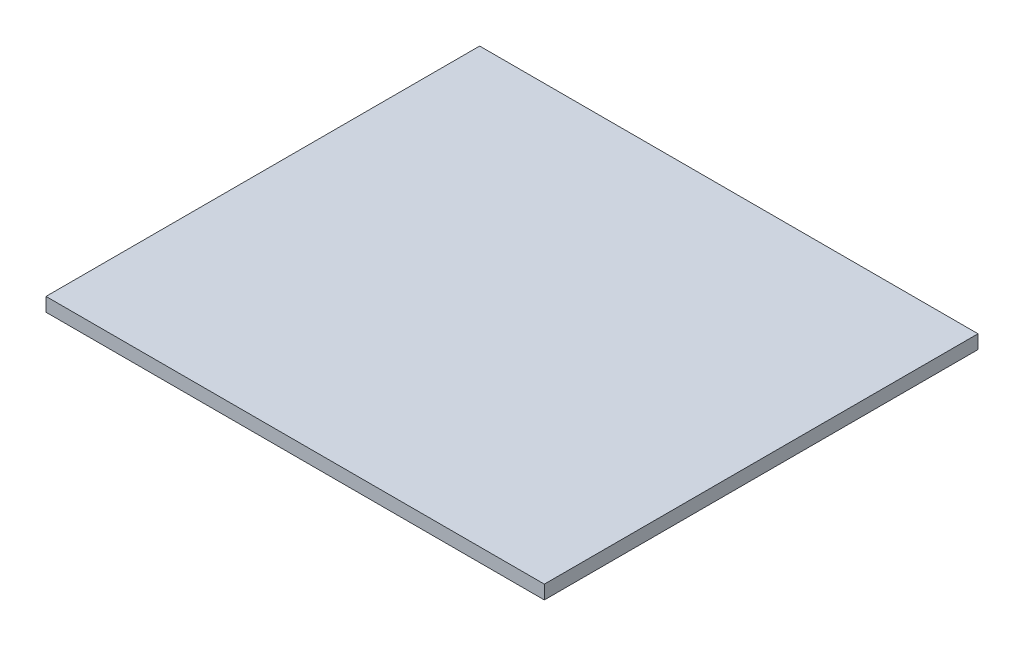
ISO-10303-21;
HEADER;
FILE_DESCRIPTION(('STEP AP214'),'2;1');
FILE_NAME('part.step','',(''),(''),'','','');
FILE_SCHEMA(('AUTOMOTIVE_DESIGN { 1 0 10303 214 1 1 1 1 }'));
ENDSEC;
DATA;
#1=APPLICATION_CONTEXT('core data for automotive mechanical design processes');
#2=APPLICATION_PROTOCOL_DEFINITION('international standard','automotive_design',2000,#1);
#3=PRODUCT_CONTEXT('',#1,'mechanical');
#4=PRODUCT('Part','Part','',(#3));
#5=PRODUCT_RELATED_PRODUCT_CATEGORY('part','',(#4));
#6=PRODUCT_DEFINITION_FORMATION('','',#4);
#7=PRODUCT_DEFINITION_CONTEXT('part definition',#1,'design');
#8=PRODUCT_DEFINITION('design','',#6,#7);
#9=PRODUCT_DEFINITION_SHAPE('','',#8);
#10=(LENGTH_UNIT() NAMED_UNIT(*) SI_UNIT(.MILLI.,.METRE.));
#11=(NAMED_UNIT(*) PLANE_ANGLE_UNIT() SI_UNIT($,.RADIAN.));
#12=(NAMED_UNIT(*) SI_UNIT($,.STERADIAN.) SOLID_ANGLE_UNIT());
#13=UNCERTAINTY_MEASURE_WITH_UNIT(LENGTH_MEASURE(1.E-05),#10,'distance_accuracy_value','');
#14=(GEOMETRIC_REPRESENTATION_CONTEXT(3) GLOBAL_UNCERTAINTY_ASSIGNED_CONTEXT((#13)) GLOBAL_UNIT_ASSIGNED_CONTEXT((#10,
#11,#12)) REPRESENTATION_CONTEXT('',''));
#15=CARTESIAN_POINT('',(0.,0.,0.));
#16=DIRECTION('',(0.,0.,1.));
#17=DIRECTION('',(1.,0.,0.));
#18=AXIS2_PLACEMENT_3D('',#15,#16,#17);
#19=CARTESIAN_POINT('',(-199.23914458526,9.7536,-36.9171322926299));
#20=DIRECTION('',(1.,0.,0.));
#21=DIRECTION('',(0.,0.,-1.));
#22=AXIS2_PLACEMENT_3D('',#19,#20,#21);
#23=PLANE('',#22);
#24=DIRECTION('',(0.,0.,1.));
#25=VECTOR('',#24,1.);
#26=CARTESIAN_POINT('',(-199.23914458526,0.,-36.9171322926299));
#27=LINE('',#26,#25);
#28=CARTESIAN_POINT('',(-199.23914458526,0.,-36.9171322926299));
#29=VERTEX_POINT('',#28);
#30=CARTESIAN_POINT('',(-199.23914458526,0.,271.13406770737));
#31=VERTEX_POINT('',#30);
#32=EDGE_CURVE('E96',#29,#31,#27,.T.);
#33=ORIENTED_EDGE('',*,*,#32,.T.);
#34=DIRECTION('',(0.,-1.,0.));
#35=VECTOR('',#34,1.);
#36=CARTESIAN_POINT('',(-199.23914458526,9.7536,271.13406770737));
#37=LINE('',#36,#35);
#38=CARTESIAN_POINT('',(-199.23914458526,9.7536,271.13406770737));
#39=VERTEX_POINT('',#38);
#40=EDGE_CURVE('E11',#39,#31,#37,.T.);
#41=ORIENTED_EDGE('',*,*,#40,.F.);
#42=DIRECTION('',(0.,0.,1.));
#43=VECTOR('',#42,1.);
#44=CARTESIAN_POINT('',(-199.23914458526,9.7536,-36.9171322926299));
#45=LINE('',#44,#43);
#46=CARTESIAN_POINT('',(-199.23914458526,9.7536,-36.9171322926299));
#47=VERTEX_POINT('',#46);
#48=EDGE_CURVE('E84',#47,#39,#45,.T.);
#49=ORIENTED_EDGE('',*,*,#48,.F.);
#50=DIRECTION('',(0.,-1.,0.));
#51=VECTOR('',#50,1.);
#52=CARTESIAN_POINT('',(-199.23914458526,9.7536,-36.9171322926299));
#53=LINE('',#52,#51);
#54=EDGE_CURVE('E92',#47,#29,#53,.T.);
#55=ORIENTED_EDGE('',*,*,#54,.T.);
#56=EDGE_LOOP('',(#33,#41,#49,#55));
#57=FACE_BOUND('',#56,.T.);
#58=ADVANCED_FACE('F33',(#57),#23,.F.);
#59=CARTESIAN_POINT('',(-199.23914458526,9.7536,271.13406770737));
#60=DIRECTION('',(0.,0.,-1.));
#61=DIRECTION('',(-1.,0.,0.));
#62=AXIS2_PLACEMENT_3D('',#59,#60,#61);
#63=PLANE('',#62);
#64=DIRECTION('',(1.,0.,0.));
#65=VECTOR('',#64,1.);
#66=CARTESIAN_POINT('',(-199.23914458526,0.,271.13406770737));
#67=LINE('',#66,#65);
#68=CARTESIAN_POINT('',(154.76573541474,0.,271.13406770737));
#69=VERTEX_POINT('',#68);
#70=EDGE_CURVE('E88',#31,#69,#67,.T.);
#71=ORIENTED_EDGE('',*,*,#70,.T.);
#72=DIRECTION('',(0.,-1.,0.));
#73=VECTOR('',#72,1.);
#74=CARTESIAN_POINT('',(154.76573541474,9.7536,271.13406770737));
#75=LINE('',#74,#73);
#76=CARTESIAN_POINT('',(154.76573541474,9.7536,271.13406770737));
#77=VERTEX_POINT('',#76);
#78=EDGE_CURVE('E41',#77,#69,#75,.T.);
#79=ORIENTED_EDGE('',*,*,#78,.F.);
#80=DIRECTION('',(1.,0.,0.));
#81=VECTOR('',#80,1.);
#82=CARTESIAN_POINT('',(-199.23914458526,9.7536,271.13406770737));
#83=LINE('',#82,#81);
#84=EDGE_CURVE('E79',#39,#77,#83,.T.);
#85=ORIENTED_EDGE('',*,*,#84,.F.);
#86=ORIENTED_EDGE('',*,*,#40,.T.);
#87=EDGE_LOOP('',(#71,#79,#85,#86));
#88=FACE_BOUND('',#87,.T.);
#89=ADVANCED_FACE('F87',(#88),#63,.F.);
#90=CARTESIAN_POINT('',(154.76573541474,9.7536,-36.9171322926299));
#91=DIRECTION('',(-1.,0.,0.));
#92=DIRECTION('',(0.,0.,1.));
#93=AXIS2_PLACEMENT_3D('',#90,#91,#92);
#94=PLANE('',#93);
#95=DIRECTION('',(0.,0.,-1.));
#96=VECTOR('',#95,1.);
#97=CARTESIAN_POINT('',(154.76573541474,0.,-36.9171322926299));
#98=LINE('',#97,#96);
#99=CARTESIAN_POINT('',(154.76573541474,0.,-36.9171322926299));
#100=VERTEX_POINT('',#99);
#101=EDGE_CURVE('E66',#69,#100,#98,.T.);
#102=ORIENTED_EDGE('',*,*,#101,.T.);
#103=DIRECTION('',(0.,-1.,0.));
#104=VECTOR('',#103,1.);
#105=CARTESIAN_POINT('',(154.76573541474,9.7536,-36.9171322926299));
#106=LINE('',#105,#104);
#107=CARTESIAN_POINT('',(154.76573541474,9.7536,-36.9171322926299));
#108=VERTEX_POINT('',#107);
#109=EDGE_CURVE('E89',#108,#100,#106,.T.);
#110=ORIENTED_EDGE('',*,*,#109,.F.);
#111=DIRECTION('',(0.,0.,-1.));
#112=VECTOR('',#111,1.);
#113=CARTESIAN_POINT('',(154.76573541474,9.7536,-36.9171322926299));
#114=LINE('',#113,#112);
#115=EDGE_CURVE('E82',#77,#108,#114,.T.);
#116=ORIENTED_EDGE('',*,*,#115,.F.);
#117=ORIENTED_EDGE('',*,*,#78,.T.);
#118=EDGE_LOOP('',(#102,#110,#116,#117));
#119=FACE_BOUND('',#118,.T.);
#120=ADVANCED_FACE('F90',(#119),#94,.F.);
#121=CARTESIAN_POINT('',(-199.23914458526,9.7536,-36.9171322926299));
#122=DIRECTION('',(0.,0.,1.));
#123=DIRECTION('',(1.,0.,0.));
#124=AXIS2_PLACEMENT_3D('',#121,#122,#123);
#125=PLANE('',#124);
#126=DIRECTION('',(-1.,0.,0.));
#127=VECTOR('',#126,1.);
#128=CARTESIAN_POINT('',(-199.23914458526,0.,-36.9171322926299));
#129=LINE('',#128,#127);
#130=EDGE_CURVE('E72',#100,#29,#129,.T.);
#131=ORIENTED_EDGE('',*,*,#130,.T.);
#132=ORIENTED_EDGE('',*,*,#54,.F.);
#133=DIRECTION('',(-1.,0.,0.));
#134=VECTOR('',#133,1.);
#135=CARTESIAN_POINT('',(-199.23914458526,9.7536,-36.9171322926299));
#136=LINE('',#135,#134);
#137=EDGE_CURVE('E49',#108,#47,#136,.T.);
#138=ORIENTED_EDGE('',*,*,#137,.F.);
#139=ORIENTED_EDGE('',*,*,#109,.T.);
#140=EDGE_LOOP('',(#131,#132,#138,#139));
#141=FACE_BOUND('',#140,.T.);
#142=ADVANCED_FACE('F103',(#141),#125,.F.);
#143=CARTESIAN_POINT('',(0.,9.7536,0.));
#144=DIRECTION('',(0.,1.,0.));
#145=DIRECTION('',(0.,0.,1.));
#146=AXIS2_PLACEMENT_3D('',#143,#144,#145);
#147=PLANE('',#146);
#148=ORIENTED_EDGE('',*,*,#48,.T.);
#149=ORIENTED_EDGE('',*,*,#84,.T.);
#150=ORIENTED_EDGE('',*,*,#115,.T.);
#151=ORIENTED_EDGE('',*,*,#137,.T.);
#152=EDGE_LOOP('',(#148,#149,#150,#151));
#153=FACE_BOUND('',#152,.T.);
#154=ADVANCED_FACE('F80',(#153),#147,.T.);
#155=CARTESIAN_POINT('',(0.,0.,0.));
#156=DIRECTION('',(0.,1.,0.));
#157=DIRECTION('',(0.,0.,1.));
#158=AXIS2_PLACEMENT_3D('',#155,#156,#157);
#159=PLANE('',#158);
#160=ORIENTED_EDGE('',*,*,#32,.F.);
#161=ORIENTED_EDGE('',*,*,#130,.F.);
#162=ORIENTED_EDGE('',*,*,#101,.F.);
#163=ORIENTED_EDGE('',*,*,#70,.F.);
#164=EDGE_LOOP('',(#160,#161,#162,#163));
#165=FACE_BOUND('',#164,.T.);
#166=ADVANCED_FACE('F106',(#165),#159,.F.);
#167=CLOSED_SHELL('',(#58,#89,#120,#142,#154,#166));
#168=MANIFOLD_SOLID_BREP('B2',#167);
#169=ADVANCED_BREP_SHAPE_REPRESENTATION('',(#18,#168),#14);
#170=SHAPE_DEFINITION_REPRESENTATION(#9,#169);
ENDSEC;
END-ISO-10303-21;
